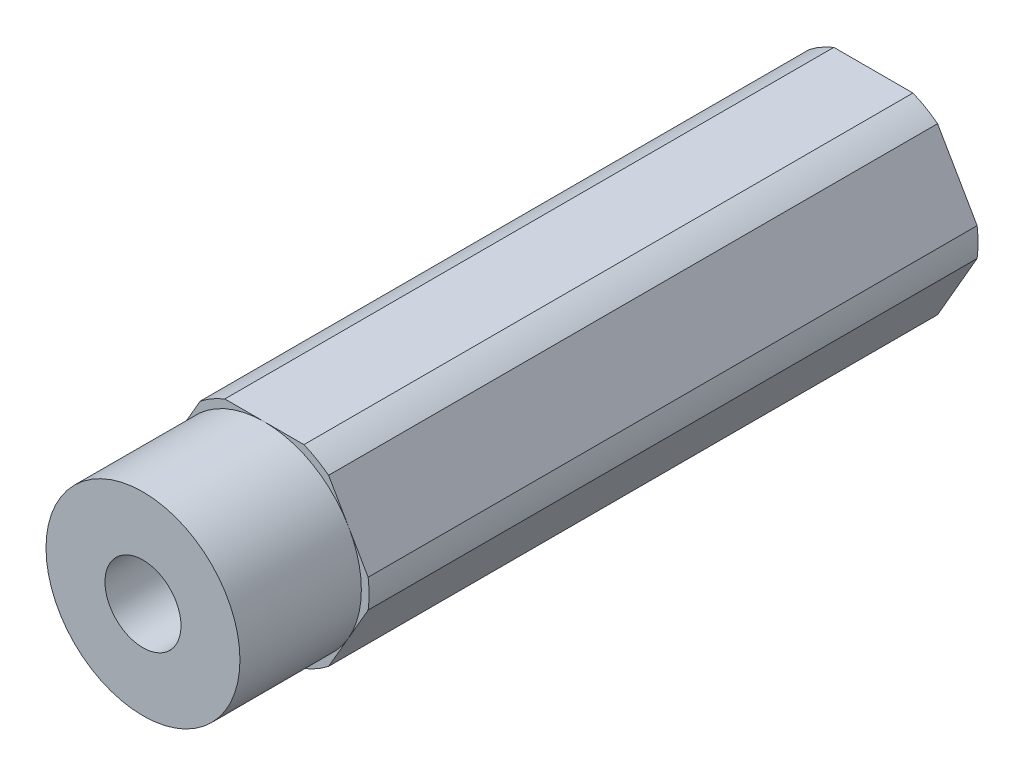
ISO-10303-21;
HEADER;
FILE_DESCRIPTION(('STEP AP214'),'2;1');
FILE_NAME('part.step','',(''),(''),'','','');
FILE_SCHEMA(('AUTOMOTIVE_DESIGN { 1 0 10303 214 1 1 1 1 }'));
ENDSEC;
DATA;
#1=APPLICATION_CONTEXT('core data for automotive mechanical design processes');
#2=APPLICATION_PROTOCOL_DEFINITION('international standard','automotive_design',2000,#1);
#3=PRODUCT_CONTEXT('',#1,'mechanical');
#4=PRODUCT('Part','Part','',(#3));
#5=PRODUCT_RELATED_PRODUCT_CATEGORY('part','',(#4));
#6=PRODUCT_DEFINITION_FORMATION('','',#4);
#7=PRODUCT_DEFINITION_CONTEXT('part definition',#1,'design');
#8=PRODUCT_DEFINITION('design','',#6,#7);
#9=PRODUCT_DEFINITION_SHAPE('','',#8);
#10=(LENGTH_UNIT() NAMED_UNIT(*) SI_UNIT(.MILLI.,.METRE.));
#11=(NAMED_UNIT(*) PLANE_ANGLE_UNIT() SI_UNIT($,.RADIAN.));
#12=(NAMED_UNIT(*) SI_UNIT($,.STERADIAN.) SOLID_ANGLE_UNIT());
#13=UNCERTAINTY_MEASURE_WITH_UNIT(LENGTH_MEASURE(1.E-05),#10,'distance_accuracy_value','');
#14=(GEOMETRIC_REPRESENTATION_CONTEXT(3) GLOBAL_UNCERTAINTY_ASSIGNED_CONTEXT((#13)) GLOBAL_UNIT_ASSIGNED_CONTEXT((#10,
#11,#12)) REPRESENTATION_CONTEXT('',''));
#15=CARTESIAN_POINT('',(0.,0.,0.));
#16=DIRECTION('',(0.,0.,1.));
#17=DIRECTION('',(1.,0.,0.));
#18=AXIS2_PLACEMENT_3D('',#15,#16,#17);
#19=CARTESIAN_POINT('',(3.66617420935413,-6.35,23.9141));
#20=DIRECTION('',(-0.866025403784439,0.499999999999999,0.));
#21=DIRECTION('',(-0.499999999999999,-0.866025403784439,0.));
#22=AXIS2_PLACEMENT_3D('',#19,#20,#21);
#23=PLANE('',#22);
#24=DIRECTION('',(0.,0.,1.));
#25=VECTOR('',#24,1.);
#26=CARTESIAN_POINT('',(4.20411035757863,-5.41826726004726,-23.9141));
#27=LINE('',#26,#25);
#28=CARTESIAN_POINT('',(4.20411035757863,-5.41826726004727,-23.9141));
#29=VERTEX_POINT('',#28);
#30=CARTESIAN_POINT('',(4.20411035757863,-5.41826726004727,15.9639));
#31=VERTEX_POINT('',#30);
#32=EDGE_CURVE('E61',#29,#31,#27,.T.);
#33=ORIENTED_EDGE('',*,*,#32,.F.);
#34=DIRECTION('',(0.499999999999999,0.866025403784439,0.));
#35=VECTOR('',#34,1.);
#36=CARTESIAN_POINT('',(3.66617420935413,-6.35,-23.9141));
#37=LINE('',#36,#35);
#38=CARTESIAN_POINT('',(6.79441227048375,-0.931732739952729,-23.9141));
#39=VERTEX_POINT('',#38);
#40=EDGE_CURVE('E180',#29,#39,#37,.T.);
#41=ORIENTED_EDGE('',*,*,#40,.T.);
#42=DIRECTION('',(0.,0.,1.));
#43=VECTOR('',#42,1.);
#44=CARTESIAN_POINT('',(6.79441227048375,-0.931732739952731,-23.9141));
#45=LINE('',#44,#43);
#46=CARTESIAN_POINT('',(6.79441227048375,-0.931732739952729,15.9639));
#47=VERTEX_POINT('',#46);
#48=EDGE_CURVE('E154',#47,#39,#45,.F.);
#49=ORIENTED_EDGE('',*,*,#48,.F.);
#50=DIRECTION('',(0.499999999999999,0.866025403784439,0.));
#51=VECTOR('',#50,1.);
#52=CARTESIAN_POINT('',(3.66617420935413,-6.35,15.9639));
#53=LINE('',#52,#51);
#54=CARTESIAN_POINT('',(5.49926131403119,-3.175,15.9639));
#55=VERTEX_POINT('',#54);
#56=EDGE_CURVE('E274',#55,#47,#53,.T.);
#57=ORIENTED_EDGE('',*,*,#56,.F.);
#58=EDGE_CURVE('E187',#31,#55,#53,.T.);
#59=ORIENTED_EDGE('',*,*,#58,.F.);
#60=EDGE_LOOP('',(#33,#41,#49,#57,#59));
#61=FACE_BOUND('',#60,.T.);
#62=ADVANCED_FACE('F46',(#61),#23,.F.);
#63=CARTESIAN_POINT('',(7.33234841870825,0.,23.9141));
#64=DIRECTION('',(-0.866025403784439,-0.5,0.));
#65=DIRECTION('',(0.5,-0.866025403784439,0.));
#66=AXIS2_PLACEMENT_3D('',#63,#64,#65);
#67=PLANE('',#66);
#68=DIRECTION('',(0.,0.,1.));
#69=VECTOR('',#68,1.);
#70=CARTESIAN_POINT('',(6.79441227048375,0.931732739952728,-23.9141));
#71=LINE('',#70,#69);
#72=CARTESIAN_POINT('',(6.79441227048375,0.931732739952728,-23.9141));
#73=VERTEX_POINT('',#72);
#74=CARTESIAN_POINT('',(6.79441227048375,0.931732739952728,15.9639));
#75=VERTEX_POINT('',#74);
#76=EDGE_CURVE('E69',#73,#75,#71,.T.);
#77=ORIENTED_EDGE('',*,*,#76,.F.);
#78=DIRECTION('',(-0.5,0.866025403784439,0.));
#79=VECTOR('',#78,1.);
#80=CARTESIAN_POINT('',(7.33234841870825,0.,-23.9141));
#81=LINE('',#80,#79);
#82=CARTESIAN_POINT('',(4.20411035757862,5.41826726004727,-23.9141));
#83=VERTEX_POINT('',#82);
#84=EDGE_CURVE('E169',#73,#83,#81,.T.);
#85=ORIENTED_EDGE('',*,*,#84,.T.);
#86=DIRECTION('',(0.,0.,1.));
#87=VECTOR('',#86,1.);
#88=CARTESIAN_POINT('',(4.20411035757862,5.41826726004727,-23.9141));
#89=LINE('',#88,#87);
#90=CARTESIAN_POINT('',(4.20411035757862,5.41826726004727,15.9639));
#91=VERTEX_POINT('',#90);
#92=EDGE_CURVE('E289',#91,#83,#89,.F.);
#93=ORIENTED_EDGE('',*,*,#92,.F.);
#94=DIRECTION('',(-0.5,0.866025403784439,0.));
#95=VECTOR('',#94,1.);
#96=CARTESIAN_POINT('',(7.33234841870825,0.,15.9639));
#97=LINE('',#96,#95);
#98=CARTESIAN_POINT('',(5.49926131403118,3.175,15.9639));
#99=VERTEX_POINT('',#98);
#100=EDGE_CURVE('E271',#99,#91,#97,.T.);
#101=ORIENTED_EDGE('',*,*,#100,.F.);
#102=EDGE_CURVE('E171',#75,#99,#97,.T.);
#103=ORIENTED_EDGE('',*,*,#102,.F.);
#104=EDGE_LOOP('',(#77,#85,#93,#101,#103));
#105=FACE_BOUND('',#104,.T.);
#106=ADVANCED_FACE('F167',(#105),#67,.F.);
#107=CARTESIAN_POINT('',(3.66617420935412,6.35,23.9141));
#108=DIRECTION('',(0.,-1.,0.));
#109=DIRECTION('',(0.,0.,-1.));
#110=AXIS2_PLACEMENT_3D('',#107,#108,#109);
#111=PLANE('',#110);
#112=DIRECTION('',(0.,0.,1.));
#113=VECTOR('',#112,1.);
#114=CARTESIAN_POINT('',(2.59030191290514,6.35,-23.9141));
#115=LINE('',#114,#113);
#116=CARTESIAN_POINT('',(2.59030191290514,6.35,-23.9141));
#117=VERTEX_POINT('',#116);
#118=CARTESIAN_POINT('',(2.59030191290514,6.35,15.9639));
#119=VERTEX_POINT('',#118);
#120=EDGE_CURVE('E292',#117,#119,#115,.T.);
#121=ORIENTED_EDGE('',*,*,#120,.F.);
#122=DIRECTION('',(-1.,0.,0.));
#123=VECTOR('',#122,1.);
#124=CARTESIAN_POINT('',(3.66617420935412,6.35,-23.9141));
#125=LINE('',#124,#123);
#126=CARTESIAN_POINT('',(-2.59030191290514,6.35,-23.9141));
#127=VERTEX_POINT('',#126);
#128=EDGE_CURVE('E179',#117,#127,#125,.T.);
#129=ORIENTED_EDGE('',*,*,#128,.T.);
#130=DIRECTION('',(0.,0.,1.));
#131=VECTOR('',#130,1.);
#132=CARTESIAN_POINT('',(-2.59030191290514,6.35,-23.9141));
#133=LINE('',#132,#131);
#134=CARTESIAN_POINT('',(-2.59030191290514,6.35,15.9639));
#135=VERTEX_POINT('',#134);
#136=EDGE_CURVE('E303',#135,#127,#133,.F.);
#137=ORIENTED_EDGE('',*,*,#136,.F.);
#138=DIRECTION('',(-1.,0.,0.));
#139=VECTOR('',#138,1.);
#140=CARTESIAN_POINT('',(3.66617420935412,6.35,15.9639));
#141=LINE('',#140,#139);
#142=CARTESIAN_POINT('',(0.,6.35,15.9639));
#143=VERTEX_POINT('',#142);
#144=EDGE_CURVE('E266',#143,#135,#141,.T.);
#145=ORIENTED_EDGE('',*,*,#144,.F.);
#146=EDGE_CURVE('E270',#119,#143,#141,.T.);
#147=ORIENTED_EDGE('',*,*,#146,.F.);
#148=EDGE_LOOP('',(#121,#129,#137,#145,#147));
#149=FACE_BOUND('',#148,.T.);
#150=ADVANCED_FACE('F365',(#149),#111,.F.);
#151=CARTESIAN_POINT('',(-3.66617420935412,6.35,23.9141));
#152=DIRECTION('',(0.866025403784439,-0.5,0.));
#153=DIRECTION('',(0.5,0.866025403784439,0.));
#154=AXIS2_PLACEMENT_3D('',#151,#152,#153);
#155=PLANE('',#154);
#156=DIRECTION('',(0.,0.,1.));
#157=VECTOR('',#156,1.);
#158=CARTESIAN_POINT('',(-4.20411035757862,5.41826726004727,-23.9141));
#159=LINE('',#158,#157);
#160=CARTESIAN_POINT('',(-4.20411035757862,5.41826726004727,-23.9141));
#161=VERTEX_POINT('',#160);
#162=CARTESIAN_POINT('',(-4.20411035757862,5.41826726004727,15.9639));
#163=VERTEX_POINT('',#162);
#164=EDGE_CURVE('E306',#161,#163,#159,.T.);
#165=ORIENTED_EDGE('',*,*,#164,.F.);
#166=DIRECTION('',(-0.5,-0.866025403784439,0.));
#167=VECTOR('',#166,1.);
#168=CARTESIAN_POINT('',(-3.66617420935412,6.35,-23.9141));
#169=LINE('',#168,#167);
#170=CARTESIAN_POINT('',(-6.79441227048375,0.931732739952721,-23.9141));
#171=VERTEX_POINT('',#170);
#172=EDGE_CURVE('E185',#161,#171,#169,.T.);
#173=ORIENTED_EDGE('',*,*,#172,.T.);
#174=DIRECTION('',(0.,0.,1.));
#175=VECTOR('',#174,1.);
#176=CARTESIAN_POINT('',(-6.79441227048375,0.931732739952721,-23.9141));
#177=LINE('',#176,#175);
#178=CARTESIAN_POINT('',(-6.79441227048375,0.931732739952721,15.9639));
#179=VERTEX_POINT('',#178);
#180=EDGE_CURVE('E313',#179,#171,#177,.F.);
#181=ORIENTED_EDGE('',*,*,#180,.F.);
#182=DIRECTION('',(-0.5,-0.866025403784439,0.));
#183=VECTOR('',#182,1.);
#184=CARTESIAN_POINT('',(-3.66617420935412,6.35,15.9639));
#185=LINE('',#184,#183);
#186=CARTESIAN_POINT('',(-5.49926131403119,3.175,15.9639));
#187=VERTEX_POINT('',#186);
#188=EDGE_CURVE('E261',#187,#179,#185,.T.);
#189=ORIENTED_EDGE('',*,*,#188,.F.);
#190=EDGE_CURVE('E265',#163,#187,#185,.T.);
#191=ORIENTED_EDGE('',*,*,#190,.F.);
#192=EDGE_LOOP('',(#165,#173,#181,#189,#191));
#193=FACE_BOUND('',#192,.T.);
#194=ADVANCED_FACE('F390',(#193),#155,.F.);
#195=CARTESIAN_POINT('',(-7.33234841870825,0.,23.9141));
#196=DIRECTION('',(0.866025403784439,0.5,0.));
#197=DIRECTION('',(-0.5,0.866025403784439,0.));
#198=AXIS2_PLACEMENT_3D('',#195,#196,#197);
#199=PLANE('',#198);
#200=DIRECTION('',(0.,0.,1.));
#201=VECTOR('',#200,1.);
#202=CARTESIAN_POINT('',(-6.79441227048375,-0.931732739952728,-23.9141));
#203=LINE('',#202,#201);
#204=CARTESIAN_POINT('',(-6.79441227048375,-0.931732739952724,-23.9141));
#205=VERTEX_POINT('',#204);
#206=CARTESIAN_POINT('',(-6.79441227048375,-0.931732739952726,15.9639));
#207=VERTEX_POINT('',#206);
#208=EDGE_CURVE('E316',#205,#207,#203,.T.);
#209=ORIENTED_EDGE('',*,*,#208,.F.);
#210=DIRECTION('',(0.5,-0.866025403784438,0.));
#211=VECTOR('',#210,1.);
#212=CARTESIAN_POINT('',(-7.33234841870825,0.,-23.9141));
#213=LINE('',#212,#211);
#214=CARTESIAN_POINT('',(-4.20411035757861,-5.41826726004728,-23.9141));
#215=VERTEX_POINT('',#214);
#216=EDGE_CURVE('E194',#205,#215,#213,.T.);
#217=ORIENTED_EDGE('',*,*,#216,.T.);
#218=DIRECTION('',(0.,0.,1.));
#219=VECTOR('',#218,1.);
#220=CARTESIAN_POINT('',(-4.20411035757862,-5.41826726004727,-23.9141));
#221=LINE('',#220,#219);
#222=CARTESIAN_POINT('',(-4.20411035757862,-5.41826726004728,15.9639));
#223=VERTEX_POINT('',#222);
#224=EDGE_CURVE('E323',#223,#215,#221,.F.);
#225=ORIENTED_EDGE('',*,*,#224,.F.);
#226=DIRECTION('',(0.5,-0.866025403784439,0.));
#227=VECTOR('',#226,1.);
#228=CARTESIAN_POINT('',(-7.33234841870825,0.,15.9639));
#229=LINE('',#228,#227);
#230=CARTESIAN_POINT('',(-5.49926131403118,-3.175,15.9639));
#231=VERTEX_POINT('',#230);
#232=EDGE_CURVE('E256',#231,#223,#229,.T.);
#233=ORIENTED_EDGE('',*,*,#232,.F.);
#234=EDGE_CURVE('E260',#207,#231,#229,.T.);
#235=ORIENTED_EDGE('',*,*,#234,.F.);
#236=EDGE_LOOP('',(#209,#217,#225,#233,#235));
#237=FACE_BOUND('',#236,.T.);
#238=ADVANCED_FACE('F404',(#237),#199,.F.);
#239=CARTESIAN_POINT('',(-3.66617420935412,-6.35000000000001,23.9141));
#240=DIRECTION('',(0.,1.,0.));
#241=DIRECTION('',(-1.,0.,0.));
#242=AXIS2_PLACEMENT_3D('',#239,#240,#241);
#243=PLANE('',#242);
#244=DIRECTION('',(0.,0.,1.));
#245=VECTOR('',#244,1.);
#246=CARTESIAN_POINT('',(-2.59030191290512,-6.35000000000001,-23.9141));
#247=LINE('',#246,#245);
#248=CARTESIAN_POINT('',(-2.59030191290512,-6.35,-23.9141));
#249=VERTEX_POINT('',#248);
#250=CARTESIAN_POINT('',(-2.59030191290512,-6.35000000000001,15.9639));
#251=VERTEX_POINT('',#250);
#252=EDGE_CURVE('E326',#249,#251,#247,.T.);
#253=ORIENTED_EDGE('',*,*,#252,.F.);
#254=DIRECTION('',(1.,0.,0.));
#255=VECTOR('',#254,1.);
#256=CARTESIAN_POINT('',(-3.66617420935412,-6.35000000000001,-23.9141));
#257=LINE('',#256,#255);
#258=CARTESIAN_POINT('',(2.59030191290513,-6.35,-23.9141));
#259=VERTEX_POINT('',#258);
#260=EDGE_CURVE('E198',#249,#259,#257,.T.);
#261=ORIENTED_EDGE('',*,*,#260,.T.);
#262=DIRECTION('',(0.,0.,1.));
#263=VECTOR('',#262,1.);
#264=CARTESIAN_POINT('',(2.59030191290513,-6.35,-23.9141));
#265=LINE('',#264,#263);
#266=CARTESIAN_POINT('',(2.59030191290513,-6.35,15.9639));
#267=VERTEX_POINT('',#266);
#268=EDGE_CURVE('E241',#267,#259,#265,.F.);
#269=ORIENTED_EDGE('',*,*,#268,.F.);
#270=DIRECTION('',(1.,0.,0.));
#271=VECTOR('',#270,1.);
#272=CARTESIAN_POINT('',(-3.66617420935412,-6.35000000000001,15.9639));
#273=LINE('',#272,#271);
#274=CARTESIAN_POINT('',(0.,-6.35,15.9639));
#275=VERTEX_POINT('',#274);
#276=EDGE_CURVE('E205',#275,#267,#273,.T.);
#277=ORIENTED_EDGE('',*,*,#276,.F.);
#278=EDGE_CURVE('E54',#251,#275,#273,.T.);
#279=ORIENTED_EDGE('',*,*,#278,.F.);
#280=EDGE_LOOP('',(#253,#261,#269,#277,#279));
#281=FACE_BOUND('',#280,.T.);
#282=ADVANCED_FACE('F240',(#281),#243,.F.);
#283=CARTESIAN_POINT('',(0.,0.,-23.9141));
#284=DIRECTION('',(0.,0.,1.));
#285=DIRECTION('',(1.,0.,0.));
#286=AXIS2_PLACEMENT_3D('',#283,#284,#285);
#287=PLANE('',#286);
#288=CARTESIAN_POINT('',(0.,0.,-23.9141));
#289=DIRECTION('',(0.,0.,1.));
#290=DIRECTION('',(1.,0.,0.));
#291=AXIS2_PLACEMENT_3D('',#288,#289,#290);
#292=CIRCLE('',#291,2.4892);
#293=CARTESIAN_POINT('',(2.4892,0.,-23.9141));
#294=VERTEX_POINT('',#293);
#295=EDGE_CURVE('E161',#294,#294,#292,.T.);
#296=ORIENTED_EDGE('',*,*,#295,.T.);
#297=EDGE_LOOP('',(#296));
#298=FACE_BOUND('',#297,.T.);
#299=CARTESIAN_POINT('',(0.,0.,-23.9141));
#300=DIRECTION('',(0.,0.,1.));
#301=DIRECTION('',(1.,0.,0.));
#302=AXIS2_PLACEMENT_3D('',#299,#300,#301);
#303=CIRCLE('',#302,6.858);
#304=EDGE_CURVE('E163',#83,#117,#303,.T.);
#305=ORIENTED_EDGE('',*,*,#304,.F.);
#306=ORIENTED_EDGE('',*,*,#84,.F.);
#307=EDGE_CURVE('E151',#39,#73,#303,.T.);
#308=ORIENTED_EDGE('',*,*,#307,.F.);
#309=ORIENTED_EDGE('',*,*,#40,.F.);
#310=EDGE_CURVE('E160',#259,#29,#303,.T.);
#311=ORIENTED_EDGE('',*,*,#310,.F.);
#312=ORIENTED_EDGE('',*,*,#260,.F.);
#313=EDGE_CURVE('E368',#215,#249,#303,.T.);
#314=ORIENTED_EDGE('',*,*,#313,.F.);
#315=ORIENTED_EDGE('',*,*,#216,.F.);
#316=EDGE_CURVE('E370',#171,#205,#303,.T.);
#317=ORIENTED_EDGE('',*,*,#316,.F.);
#318=ORIENTED_EDGE('',*,*,#172,.F.);
#319=EDGE_CURVE('E373',#127,#161,#303,.T.);
#320=ORIENTED_EDGE('',*,*,#319,.F.);
#321=ORIENTED_EDGE('',*,*,#128,.F.);
#322=EDGE_LOOP('',(#305,#306,#308,#309,#311,#312,#314,#315,#317,#318,#320,#321));
#323=FACE_BOUND('',#322,.T.);
#324=ADVANCED_FACE('F176',(#298,#323),#287,.F.);
#325=CARTESIAN_POINT('',(0.,0.,15.9639));
#326=DIRECTION('',(0.,0.,1.));
#327=DIRECTION('',(1.,0.,0.));
#328=AXIS2_PLACEMENT_3D('',#325,#326,#327);
#329=PLANE('',#328);
#330=ORIENTED_EDGE('',*,*,#276,.T.);
#331=CARTESIAN_POINT('',(0.,0.,15.9639));
#332=DIRECTION('',(0.,0.,1.));
#333=DIRECTION('',(1.,0.,0.));
#334=AXIS2_PLACEMENT_3D('',#331,#332,#333);
#335=CIRCLE('',#334,6.858);
#336=EDGE_CURVE('E245',#267,#31,#335,.T.);
#337=ORIENTED_EDGE('',*,*,#336,.T.);
#338=ORIENTED_EDGE('',*,*,#58,.T.);
#339=CARTESIAN_POINT('',(0.,0.,15.9639));
#340=DIRECTION('',(0.,0.,1.));
#341=DIRECTION('',(1.,0.,0.));
#342=AXIS2_PLACEMENT_3D('',#339,#340,#341);
#343=CIRCLE('',#342,6.35);
#344=EDGE_CURVE('E226',#275,#55,#343,.T.);
#345=ORIENTED_EDGE('',*,*,#344,.F.);
#346=EDGE_LOOP('',(#330,#337,#338,#345));
#347=FACE_BOUND('',#346,.T.);
#348=ADVANCED_FACE('F234',(#347),#329,.T.);
#349=ORIENTED_EDGE('',*,*,#56,.T.);
#350=CARTESIAN_POINT('',(0.,0.,15.9639));
#351=DIRECTION('',(0.,0.,1.));
#352=DIRECTION('',(1.,0.,0.));
#353=AXIS2_PLACEMENT_3D('',#350,#351,#352);
#354=CIRCLE('',#353,6.858);
#355=EDGE_CURVE('E173',#47,#75,#354,.T.);
#356=ORIENTED_EDGE('',*,*,#355,.T.);
#357=ORIENTED_EDGE('',*,*,#102,.T.);
#358=EDGE_CURVE('E238',#55,#99,#343,.T.);
#359=ORIENTED_EDGE('',*,*,#358,.F.);
#360=EDGE_LOOP('',(#349,#356,#357,#359));
#361=FACE_BOUND('',#360,.T.);
#362=ADVANCED_FACE('F280',(#361),#329,.T.);
#363=ORIENTED_EDGE('',*,*,#100,.T.);
#364=CARTESIAN_POINT('',(0.,0.,15.9639));
#365=DIRECTION('',(0.,0.,1.));
#366=DIRECTION('',(1.,0.,0.));
#367=AXIS2_PLACEMENT_3D('',#364,#365,#366);
#368=CIRCLE('',#367,6.858);
#369=EDGE_CURVE('E297',#91,#119,#368,.T.);
#370=ORIENTED_EDGE('',*,*,#369,.T.);
#371=ORIENTED_EDGE('',*,*,#146,.T.);
#372=EDGE_CURVE('E252',#99,#143,#343,.T.);
#373=ORIENTED_EDGE('',*,*,#372,.F.);
#374=EDGE_LOOP('',(#363,#370,#371,#373));
#375=FACE_BOUND('',#374,.T.);
#376=ADVANCED_FACE('F285',(#375),#329,.T.);
#377=ORIENTED_EDGE('',*,*,#144,.T.);
#378=CARTESIAN_POINT('',(0.,0.,15.9639));
#379=DIRECTION('',(0.,0.,1.));
#380=DIRECTION('',(1.,0.,0.));
#381=AXIS2_PLACEMENT_3D('',#378,#379,#380);
#382=CIRCLE('',#381,6.858);
#383=EDGE_CURVE('E309',#135,#163,#382,.T.);
#384=ORIENTED_EDGE('',*,*,#383,.T.);
#385=ORIENTED_EDGE('',*,*,#190,.T.);
#386=EDGE_CURVE('E257',#143,#187,#343,.T.);
#387=ORIENTED_EDGE('',*,*,#386,.F.);
#388=EDGE_LOOP('',(#377,#384,#385,#387));
#389=FACE_BOUND('',#388,.T.);
#390=ADVANCED_FACE('F395',(#389),#329,.T.);
#391=ORIENTED_EDGE('',*,*,#188,.T.);
#392=CARTESIAN_POINT('',(0.,0.,15.9639));
#393=DIRECTION('',(0.,0.,1.));
#394=DIRECTION('',(1.,0.,0.));
#395=AXIS2_PLACEMENT_3D('',#392,#393,#394);
#396=CIRCLE('',#395,6.858);
#397=EDGE_CURVE('E319',#179,#207,#396,.T.);
#398=ORIENTED_EDGE('',*,*,#397,.T.);
#399=ORIENTED_EDGE('',*,*,#234,.T.);
#400=EDGE_CURVE('E230',#187,#231,#343,.T.);
#401=ORIENTED_EDGE('',*,*,#400,.F.);
#402=EDGE_LOOP('',(#391,#398,#399,#401));
#403=FACE_BOUND('',#402,.T.);
#404=ADVANCED_FACE('F358',(#403),#329,.T.);
#405=ORIENTED_EDGE('',*,*,#232,.T.);
#406=CARTESIAN_POINT('',(0.,0.,15.9639));
#407=DIRECTION('',(0.,0.,1.));
#408=DIRECTION('',(1.,0.,0.));
#409=AXIS2_PLACEMENT_3D('',#406,#407,#408);
#410=CIRCLE('',#409,6.858);
#411=EDGE_CURVE('E12',#223,#251,#410,.T.);
#412=ORIENTED_EDGE('',*,*,#411,.T.);
#413=ORIENTED_EDGE('',*,*,#278,.T.);
#414=EDGE_CURVE('E218',#231,#275,#343,.T.);
#415=ORIENTED_EDGE('',*,*,#414,.F.);
#416=EDGE_LOOP('',(#405,#412,#413,#415));
#417=FACE_BOUND('',#416,.T.);
#418=ADVANCED_FACE('F217',(#417),#329,.T.);
#419=CARTESIAN_POINT('',(0.,0.,15.9639));
#420=DIRECTION('',(0.,0.,1.));
#421=DIRECTION('',(1.,0.,0.));
#422=AXIS2_PLACEMENT_3D('',#419,#420,#421);
#423=CYLINDRICAL_SURFACE('',#422,6.35);
#424=CARTESIAN_POINT('',(0.,0.,23.9141));
#425=DIRECTION('',(0.,0.,1.));
#426=DIRECTION('',(1.,0.,0.));
#427=AXIS2_PLACEMENT_3D('',#424,#425,#426);
#428=CIRCLE('',#427,6.35);
#429=CARTESIAN_POINT('',(6.35,0.,23.9141));
#430=VERTEX_POINT('',#429);
#431=EDGE_CURVE('E202',#430,#430,#428,.T.);
#432=ORIENTED_EDGE('',*,*,#431,.F.);
#433=EDGE_LOOP('',(#432));
#434=FACE_BOUND('',#433,.T.);
#435=ORIENTED_EDGE('',*,*,#344,.T.);
#436=ORIENTED_EDGE('',*,*,#358,.T.);
#437=ORIENTED_EDGE('',*,*,#372,.T.);
#438=ORIENTED_EDGE('',*,*,#386,.T.);
#439=ORIENTED_EDGE('',*,*,#400,.T.);
#440=ORIENTED_EDGE('',*,*,#414,.T.);
#441=EDGE_LOOP('',(#435,#436,#437,#438,#439,#440));
#442=FACE_BOUND('',#441,.T.);
#443=ADVANCED_FACE('F224',(#434,#442),#423,.T.);
#444=CARTESIAN_POINT('',(0.,0.,23.9141));
#445=DIRECTION('',(0.,0.,1.));
#446=DIRECTION('',(1.,0.,0.));
#447=AXIS2_PLACEMENT_3D('',#444,#445,#446);
#448=PLANE('',#447);
#449=CARTESIAN_POINT('',(0.,0.,23.9141));
#450=DIRECTION('',(0.,0.,1.));
#451=DIRECTION('',(1.,0.,0.));
#452=AXIS2_PLACEMENT_3D('',#449,#450,#451);
#453=CIRCLE('',#452,2.4892);
#454=CARTESIAN_POINT('',(2.4892,0.,23.9141));
#455=VERTEX_POINT('',#454);
#456=EDGE_CURVE('E329',#455,#455,#453,.T.);
#457=ORIENTED_EDGE('',*,*,#456,.F.);
#458=EDGE_LOOP('',(#457));
#459=FACE_BOUND('',#458,.T.);
#460=ORIENTED_EDGE('',*,*,#431,.T.);
#461=EDGE_LOOP('',(#460));
#462=FACE_BOUND('',#461,.T.);
#463=ADVANCED_FACE('F345',(#459,#462),#448,.T.);
#464=CARTESIAN_POINT('',(0.,0.,-23.9141));
#465=DIRECTION('',(0.,0.,1.));
#466=DIRECTION('',(1.,0.,0.));
#467=AXIS2_PLACEMENT_3D('',#464,#465,#466);
#468=CYLINDRICAL_SURFACE('',#467,6.858);
#469=ORIENTED_EDGE('',*,*,#224,.T.);
#470=ORIENTED_EDGE('',*,*,#313,.T.);
#471=ORIENTED_EDGE('',*,*,#252,.T.);
#472=ORIENTED_EDGE('',*,*,#411,.F.);
#473=EDGE_LOOP('',(#469,#470,#471,#472));
#474=FACE_BOUND('',#473,.T.);
#475=ADVANCED_FACE('F348',(#474),#468,.T.);
#476=ORIENTED_EDGE('',*,*,#180,.T.);
#477=ORIENTED_EDGE('',*,*,#316,.T.);
#478=ORIENTED_EDGE('',*,*,#208,.T.);
#479=ORIENTED_EDGE('',*,*,#397,.F.);
#480=EDGE_LOOP('',(#476,#477,#478,#479));
#481=FACE_BOUND('',#480,.T.);
#482=ADVANCED_FACE('F407',(#481),#468,.T.);
#483=ORIENTED_EDGE('',*,*,#136,.T.);
#484=ORIENTED_EDGE('',*,*,#319,.T.);
#485=ORIENTED_EDGE('',*,*,#164,.T.);
#486=ORIENTED_EDGE('',*,*,#383,.F.);
#487=EDGE_LOOP('',(#483,#484,#485,#486));
#488=FACE_BOUND('',#487,.T.);
#489=ADVANCED_FACE('F393',(#488),#468,.T.);
#490=ORIENTED_EDGE('',*,*,#92,.T.);
#491=ORIENTED_EDGE('',*,*,#304,.T.);
#492=ORIENTED_EDGE('',*,*,#120,.T.);
#493=ORIENTED_EDGE('',*,*,#369,.F.);
#494=EDGE_LOOP('',(#490,#491,#492,#493));
#495=FACE_BOUND('',#494,.T.);
#496=ADVANCED_FACE('F383',(#495),#468,.T.);
#497=ORIENTED_EDGE('',*,*,#48,.T.);
#498=ORIENTED_EDGE('',*,*,#307,.T.);
#499=ORIENTED_EDGE('',*,*,#76,.T.);
#500=ORIENTED_EDGE('',*,*,#355,.F.);
#501=EDGE_LOOP('',(#497,#498,#499,#500));
#502=FACE_BOUND('',#501,.T.);
#503=ADVANCED_FACE('F152',(#502),#468,.T.);
#504=ORIENTED_EDGE('',*,*,#32,.T.);
#505=ORIENTED_EDGE('',*,*,#336,.F.);
#506=ORIENTED_EDGE('',*,*,#268,.T.);
#507=ORIENTED_EDGE('',*,*,#310,.T.);
#508=EDGE_LOOP('',(#504,#505,#506,#507));
#509=FACE_BOUND('',#508,.T.);
#510=ADVANCED_FACE('F341',(#509),#468,.T.);
#511=CARTESIAN_POINT('',(0.,0.,-23.9141));
#512=DIRECTION('',(0.,0.,1.));
#513=DIRECTION('',(1.,0.,0.));
#514=AXIS2_PLACEMENT_3D('',#511,#512,#513);
#515=CYLINDRICAL_SURFACE('',#514,2.4892);
#516=ORIENTED_EDGE('',*,*,#295,.F.);
#517=EDGE_LOOP('',(#516));
#518=FACE_BOUND('',#517,.T.);
#519=ORIENTED_EDGE('',*,*,#456,.T.);
#520=EDGE_LOOP('',(#519));
#521=FACE_BOUND('',#520,.T.);
#522=ADVANCED_FACE('F338',(#518,#521),#515,.F.);
#523=CLOSED_SHELL('',(#62,#106,#150,#194,#238,#282,#324,#348,#362,#376,#390,#404,#418,#443,#463,
#475,#482,#489,#496,#503,#510,#522));
#524=MANIFOLD_SOLID_BREP('B2',#523);
#525=ADVANCED_BREP_SHAPE_REPRESENTATION('',(#18,#524),#14);
#526=SHAPE_DEFINITION_REPRESENTATION(#9,#525);
ENDSEC;
END-ISO-10303-21;
